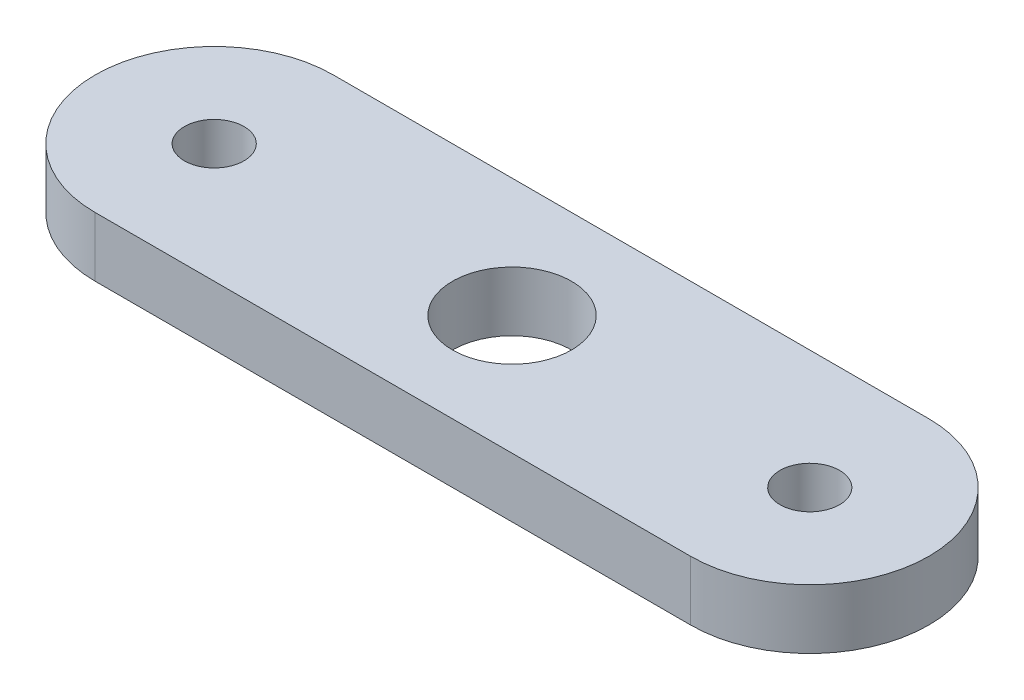
ISO-10303-21;
HEADER;
FILE_DESCRIPTION(('STEP AP214'),'2;1');
FILE_NAME('part.step','',(''),(''),'','','');
FILE_SCHEMA(('AUTOMOTIVE_DESIGN { 1 0 10303 214 1 1 1 1 }'));
ENDSEC;
DATA;
#1=APPLICATION_CONTEXT('core data for automotive mechanical design processes');
#2=APPLICATION_PROTOCOL_DEFINITION('international standard','automotive_design',2000,#1);
#3=PRODUCT_CONTEXT('',#1,'mechanical');
#4=PRODUCT('Part','Part','',(#3));
#5=PRODUCT_RELATED_PRODUCT_CATEGORY('part','',(#4));
#6=PRODUCT_DEFINITION_FORMATION('','',#4);
#7=PRODUCT_DEFINITION_CONTEXT('part definition',#1,'design');
#8=PRODUCT_DEFINITION('design','',#6,#7);
#9=PRODUCT_DEFINITION_SHAPE('','',#8);
#10=(LENGTH_UNIT() NAMED_UNIT(*) SI_UNIT(.MILLI.,.METRE.));
#11=(NAMED_UNIT(*) PLANE_ANGLE_UNIT() SI_UNIT($,.RADIAN.));
#12=(NAMED_UNIT(*) SI_UNIT($,.STERADIAN.) SOLID_ANGLE_UNIT());
#13=UNCERTAINTY_MEASURE_WITH_UNIT(LENGTH_MEASURE(1.E-05),#10,'distance_accuracy_value','');
#14=(GEOMETRIC_REPRESENTATION_CONTEXT(3) GLOBAL_UNCERTAINTY_ASSIGNED_CONTEXT((#13)) GLOBAL_UNIT_ASSIGNED_CONTEXT((#10,
#11,#12)) REPRESENTATION_CONTEXT('',''));
#15=CARTESIAN_POINT('',(0.,0.,0.));
#16=DIRECTION('',(0.,0.,1.));
#17=DIRECTION('',(1.,0.,0.));
#18=AXIS2_PLACEMENT_3D('',#15,#16,#17);
#19=CARTESIAN_POINT('',(-10.02,6.002,0.));
#20=DIRECTION('',(0.,1.,0.));
#21=DIRECTION('',(0.,0.,1.));
#22=AXIS2_PLACEMENT_3D('',#19,#20,#21);
#23=PLANE('',#22);
#24=CARTESIAN_POINT('',(-10.02,6.002,0.));
#25=DIRECTION('',(0.,1.,0.));
#26=DIRECTION('',(0.,0.,1.));
#27=AXIS2_PLACEMENT_3D('',#24,#25,#26);
#28=CIRCLE('',#27,1.002);
#29=CARTESIAN_POINT('',(-10.02,6.002,1.00199999999999));
#30=VERTEX_POINT('',#29);
#31=EDGE_CURVE('E138',#30,#30,#28,.T.);
#32=ORIENTED_EDGE('',*,*,#31,.F.);
#33=EDGE_LOOP('',(#32));
#34=FACE_BOUND('',#33,.T.);
#35=CARTESIAN_POINT('',(-10.02,6.002,0.));
#36=DIRECTION('',(0.,1.,0.));
#37=DIRECTION('',(0.,0.,1.));
#38=AXIS2_PLACEMENT_3D('',#35,#36,#37);
#39=CIRCLE('',#38,4.008);
#40=CARTESIAN_POINT('',(-10.02,6.002,-4.00800000000001));
#41=VERTEX_POINT('',#40);
#42=CARTESIAN_POINT('',(-10.02,6.002,4.00799999999999));
#43=VERTEX_POINT('',#42);
#44=EDGE_CURVE('E96',#41,#43,#39,.T.);
#45=ORIENTED_EDGE('',*,*,#44,.T.);
#46=DIRECTION('',(1.,0.,0.));
#47=VECTOR('',#46,1.);
#48=CARTESIAN_POINT('',(-10.02,6.002,4.00799999999999));
#49=LINE('',#48,#47);
#50=CARTESIAN_POINT('',(10.02,6.002,4.00799999999999));
#51=VERTEX_POINT('',#50);
#52=EDGE_CURVE('E91',#43,#51,#49,.T.);
#53=ORIENTED_EDGE('',*,*,#52,.T.);
#54=CARTESIAN_POINT('',(10.02,6.002,0.));
#55=DIRECTION('',(0.,1.,0.));
#56=DIRECTION('',(0.,0.,1.));
#57=AXIS2_PLACEMENT_3D('',#54,#55,#56);
#58=CIRCLE('',#57,4.008);
#59=CARTESIAN_POINT('',(10.02,6.002,-4.00800000000002));
#60=VERTEX_POINT('',#59);
#61=EDGE_CURVE('E94',#51,#60,#58,.T.);
#62=ORIENTED_EDGE('',*,*,#61,.T.);
#63=DIRECTION('',(-1.,0.,0.));
#64=VECTOR('',#63,1.);
#65=CARTESIAN_POINT('',(-10.02,6.002,-4.00800000000001));
#66=LINE('',#65,#64);
#67=EDGE_CURVE('E61',#60,#41,#66,.T.);
#68=ORIENTED_EDGE('',*,*,#67,.T.);
#69=EDGE_LOOP('',(#45,#53,#62,#68));
#70=FACE_BOUND('',#69,.T.);
#71=CARTESIAN_POINT('',(10.02,6.002,0.));
#72=DIRECTION('',(0.,1.,0.));
#73=DIRECTION('',(0.,0.,1.));
#74=AXIS2_PLACEMENT_3D('',#71,#72,#73);
#75=CIRCLE('',#74,1.002);
#76=CARTESIAN_POINT('',(10.02,6.002,1.00199999999999));
#77=VERTEX_POINT('',#76);
#78=EDGE_CURVE('E116',#77,#77,#75,.T.);
#79=ORIENTED_EDGE('',*,*,#78,.F.);
#80=EDGE_LOOP('',(#79));
#81=FACE_BOUND('',#80,.T.);
#82=CARTESIAN_POINT('',(0.,6.002,0.));
#83=DIRECTION('',(0.,1.,0.));
#84=DIRECTION('',(0.,0.,1.));
#85=AXIS2_PLACEMENT_3D('',#82,#83,#84);
#86=CIRCLE('',#85,2.004);
#87=CARTESIAN_POINT('',(0.,6.002,2.00399999999999));
#88=VERTEX_POINT('',#87);
#89=EDGE_CURVE('E146',#88,#88,#86,.T.);
#90=ORIENTED_EDGE('',*,*,#89,.F.);
#91=EDGE_LOOP('',(#90));
#92=FACE_BOUND('',#91,.T.);
#93=ADVANCED_FACE('F43',(#34,#70,#81,#92),#23,.T.);
#94=CARTESIAN_POINT('',(-10.02,3.998,0.));
#95=DIRECTION('',(0.,1.,0.));
#96=DIRECTION('',(0.,0.,1.));
#97=AXIS2_PLACEMENT_3D('',#94,#95,#96);
#98=PLANE('',#97);
#99=CARTESIAN_POINT('',(-10.02,3.998,0.));
#100=DIRECTION('',(0.,1.,0.));
#101=DIRECTION('',(0.,0.,1.));
#102=AXIS2_PLACEMENT_3D('',#99,#100,#101);
#103=CIRCLE('',#102,4.008);
#104=CARTESIAN_POINT('',(-10.02,3.998,-4.00800000000001));
#105=VERTEX_POINT('',#104);
#106=CARTESIAN_POINT('',(-10.02,3.998,4.00799999999999));
#107=VERTEX_POINT('',#106);
#108=EDGE_CURVE('E112',#105,#107,#103,.T.);
#109=ORIENTED_EDGE('',*,*,#108,.F.);
#110=DIRECTION('',(-1.,0.,0.));
#111=VECTOR('',#110,1.);
#112=CARTESIAN_POINT('',(-10.02,3.998,-4.00800000000001));
#113=LINE('',#112,#111);
#114=CARTESIAN_POINT('',(10.02,3.998,-4.00800000000002));
#115=VERTEX_POINT('',#114);
#116=EDGE_CURVE('E84',#115,#105,#113,.T.);
#117=ORIENTED_EDGE('',*,*,#116,.F.);
#118=CARTESIAN_POINT('',(10.02,3.998,0.));
#119=DIRECTION('',(0.,1.,0.));
#120=DIRECTION('',(0.,0.,1.));
#121=AXIS2_PLACEMENT_3D('',#118,#119,#120);
#122=CIRCLE('',#121,4.008);
#123=CARTESIAN_POINT('',(10.02,3.998,4.00799999999999));
#124=VERTEX_POINT('',#123);
#125=EDGE_CURVE('E78',#124,#115,#122,.T.);
#126=ORIENTED_EDGE('',*,*,#125,.F.);
#127=DIRECTION('',(1.,0.,0.));
#128=VECTOR('',#127,1.);
#129=CARTESIAN_POINT('',(-10.02,3.998,4.00799999999999));
#130=LINE('',#129,#128);
#131=EDGE_CURVE('E101',#107,#124,#130,.T.);
#132=ORIENTED_EDGE('',*,*,#131,.F.);
#133=EDGE_LOOP('',(#109,#117,#126,#132));
#134=FACE_BOUND('',#133,.T.);
#135=CARTESIAN_POINT('',(10.02,3.998,0.));
#136=DIRECTION('',(0.,1.,0.));
#137=DIRECTION('',(0.,0.,1.));
#138=AXIS2_PLACEMENT_3D('',#135,#136,#137);
#139=CIRCLE('',#138,1.002);
#140=CARTESIAN_POINT('',(10.02,3.998,1.00199999999999));
#141=VERTEX_POINT('',#140);
#142=EDGE_CURVE('E134',#141,#141,#139,.T.);
#143=ORIENTED_EDGE('',*,*,#142,.T.);
#144=EDGE_LOOP('',(#143));
#145=FACE_BOUND('',#144,.T.);
#146=CARTESIAN_POINT('',(-10.02,3.998,0.));
#147=DIRECTION('',(0.,1.,0.));
#148=DIRECTION('',(0.,0.,1.));
#149=AXIS2_PLACEMENT_3D('',#146,#147,#148);
#150=CIRCLE('',#149,1.002);
#151=CARTESIAN_POINT('',(-10.02,3.998,1.00199999999999));
#152=VERTEX_POINT('',#151);
#153=EDGE_CURVE('E142',#152,#152,#150,.T.);
#154=ORIENTED_EDGE('',*,*,#153,.T.);
#155=EDGE_LOOP('',(#154));
#156=FACE_BOUND('',#155,.T.);
#157=CARTESIAN_POINT('',(0.,3.998,0.));
#158=DIRECTION('',(0.,1.,0.));
#159=DIRECTION('',(0.,0.,1.));
#160=AXIS2_PLACEMENT_3D('',#157,#158,#159);
#161=CIRCLE('',#160,2.004);
#162=CARTESIAN_POINT('',(0.,3.998,2.00399999999999));
#163=VERTEX_POINT('',#162);
#164=EDGE_CURVE('E150',#163,#163,#161,.T.);
#165=ORIENTED_EDGE('',*,*,#164,.T.);
#166=EDGE_LOOP('',(#165));
#167=FACE_BOUND('',#166,.T.);
#168=ADVANCED_FACE('F129',(#134,#145,#156,#167),#98,.F.);
#169=CARTESIAN_POINT('',(-10.02,6.002,0.));
#170=DIRECTION('',(0.,-1.,0.));
#171=DIRECTION('',(0.,0.,-1.));
#172=AXIS2_PLACEMENT_3D('',#169,#170,#171);
#173=CYLINDRICAL_SURFACE('',#172,4.008);
#174=ORIENTED_EDGE('',*,*,#108,.T.);
#175=DIRECTION('',(0.,-1.,0.));
#176=VECTOR('',#175,1.);
#177=CARTESIAN_POINT('',(-10.02,6.002,4.00799999999999));
#178=LINE('',#177,#176);
#179=EDGE_CURVE('E11',#43,#107,#178,.T.);
#180=ORIENTED_EDGE('',*,*,#179,.F.);
#181=ORIENTED_EDGE('',*,*,#44,.F.);
#182=DIRECTION('',(0.,-1.,0.));
#183=VECTOR('',#182,1.);
#184=CARTESIAN_POINT('',(-10.02,6.002,-4.00800000000001));
#185=LINE('',#184,#183);
#186=EDGE_CURVE('E108',#41,#105,#185,.T.);
#187=ORIENTED_EDGE('',*,*,#186,.T.);
#188=EDGE_LOOP('',(#174,#180,#181,#187));
#189=FACE_BOUND('',#188,.T.);
#190=ADVANCED_FACE('F45',(#189),#173,.T.);
#191=CARTESIAN_POINT('',(-10.02,6.002,4.00799999999999));
#192=DIRECTION('',(0.,0.,-1.));
#193=DIRECTION('',(-1.,0.,0.));
#194=AXIS2_PLACEMENT_3D('',#191,#192,#193);
#195=PLANE('',#194);
#196=ORIENTED_EDGE('',*,*,#131,.T.);
#197=DIRECTION('',(0.,-1.,0.));
#198=VECTOR('',#197,1.);
#199=CARTESIAN_POINT('',(10.02,6.002,4.00799999999999));
#200=LINE('',#199,#198);
#201=EDGE_CURVE('E53',#51,#124,#200,.T.);
#202=ORIENTED_EDGE('',*,*,#201,.F.);
#203=ORIENTED_EDGE('',*,*,#52,.F.);
#204=ORIENTED_EDGE('',*,*,#179,.T.);
#205=EDGE_LOOP('',(#196,#202,#203,#204));
#206=FACE_BOUND('',#205,.T.);
#207=ADVANCED_FACE('F100',(#206),#195,.F.);
#208=CARTESIAN_POINT('',(10.02,6.002,0.));
#209=DIRECTION('',(0.,-1.,0.));
#210=DIRECTION('',(0.,0.,-1.));
#211=AXIS2_PLACEMENT_3D('',#208,#209,#210);
#212=CYLINDRICAL_SURFACE('',#211,4.008);
#213=ORIENTED_EDGE('',*,*,#125,.T.);
#214=DIRECTION('',(0.,-1.,0.));
#215=VECTOR('',#214,1.);
#216=CARTESIAN_POINT('',(10.02,6.002,-4.00800000000002));
#217=LINE('',#216,#215);
#218=EDGE_CURVE('E103',#60,#115,#217,.T.);
#219=ORIENTED_EDGE('',*,*,#218,.F.);
#220=ORIENTED_EDGE('',*,*,#61,.F.);
#221=ORIENTED_EDGE('',*,*,#201,.T.);
#222=EDGE_LOOP('',(#213,#219,#220,#221));
#223=FACE_BOUND('',#222,.T.);
#224=ADVANCED_FACE('F104',(#223),#212,.T.);
#225=CARTESIAN_POINT('',(-10.02,6.002,-4.00800000000001));
#226=DIRECTION('',(0.,0.,1.));
#227=DIRECTION('',(1.,0.,0.));
#228=AXIS2_PLACEMENT_3D('',#225,#226,#227);
#229=PLANE('',#228);
#230=ORIENTED_EDGE('',*,*,#116,.T.);
#231=ORIENTED_EDGE('',*,*,#186,.F.);
#232=ORIENTED_EDGE('',*,*,#67,.F.);
#233=ORIENTED_EDGE('',*,*,#218,.T.);
#234=EDGE_LOOP('',(#230,#231,#232,#233));
#235=FACE_BOUND('',#234,.T.);
#236=ADVANCED_FACE('F126',(#235),#229,.F.);
#237=CARTESIAN_POINT('',(10.02,6.002,0.));
#238=DIRECTION('',(0.,-1.,0.));
#239=DIRECTION('',(0.,0.,-1.));
#240=AXIS2_PLACEMENT_3D('',#237,#238,#239);
#241=CYLINDRICAL_SURFACE('',#240,1.002);
#242=ORIENTED_EDGE('',*,*,#78,.T.);
#243=EDGE_LOOP('',(#242));
#244=FACE_BOUND('',#243,.T.);
#245=ORIENTED_EDGE('',*,*,#142,.F.);
#246=EDGE_LOOP('',(#245));
#247=FACE_BOUND('',#246,.T.);
#248=ADVANCED_FACE('F170',(#244,#247),#241,.F.);
#249=CARTESIAN_POINT('',(-10.02,6.002,0.));
#250=DIRECTION('',(0.,-1.,0.));
#251=DIRECTION('',(0.,0.,-1.));
#252=AXIS2_PLACEMENT_3D('',#249,#250,#251);
#253=CYLINDRICAL_SURFACE('',#252,1.002);
#254=ORIENTED_EDGE('',*,*,#31,.T.);
#255=EDGE_LOOP('',(#254));
#256=FACE_BOUND('',#255,.T.);
#257=ORIENTED_EDGE('',*,*,#153,.F.);
#258=EDGE_LOOP('',(#257));
#259=FACE_BOUND('',#258,.T.);
#260=ADVANCED_FACE('F224',(#256,#259),#253,.F.);
#261=CARTESIAN_POINT('',(0.,6.002,0.));
#262=DIRECTION('',(0.,-1.,0.));
#263=DIRECTION('',(0.,0.,-1.));
#264=AXIS2_PLACEMENT_3D('',#261,#262,#263);
#265=CYLINDRICAL_SURFACE('',#264,2.004);
#266=ORIENTED_EDGE('',*,*,#89,.T.);
#267=EDGE_LOOP('',(#266));
#268=FACE_BOUND('',#267,.T.);
#269=ORIENTED_EDGE('',*,*,#164,.F.);
#270=EDGE_LOOP('',(#269));
#271=FACE_BOUND('',#270,.T.);
#272=ADVANCED_FACE('F158',(#268,#271),#265,.F.);
#273=CLOSED_SHELL('',(#93,#168,#190,#207,#224,#236,#248,#260,#272));
#274=MANIFOLD_SOLID_BREP('B2',#273);
#275=ADVANCED_BREP_SHAPE_REPRESENTATION('',(#18,#274),#14);
#276=SHAPE_DEFINITION_REPRESENTATION(#9,#275);
ENDSEC;
END-ISO-10303-21;
